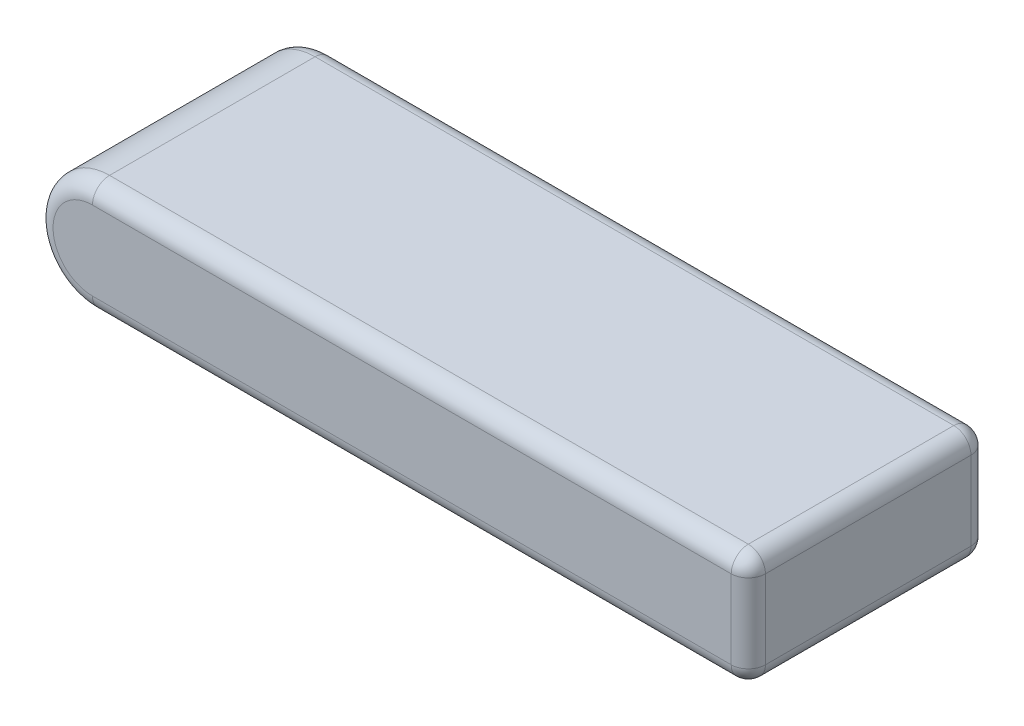
ISO-10303-21;
HEADER;
FILE_DESCRIPTION(('STEP AP214'),'2;1');
FILE_NAME('part.step','',(''),(''),'','','');
FILE_SCHEMA(('AUTOMOTIVE_DESIGN { 1 0 10303 214 1 1 1 1 }'));
ENDSEC;
DATA;
#1=APPLICATION_CONTEXT('core data for automotive mechanical design processes');
#2=APPLICATION_PROTOCOL_DEFINITION('international standard','automotive_design',2000,#1);
#3=PRODUCT_CONTEXT('',#1,'mechanical');
#4=PRODUCT('Part','Part','',(#3));
#5=PRODUCT_RELATED_PRODUCT_CATEGORY('part','',(#4));
#6=PRODUCT_DEFINITION_FORMATION('','',#4);
#7=PRODUCT_DEFINITION_CONTEXT('part definition',#1,'design');
#8=PRODUCT_DEFINITION('design','',#6,#7);
#9=PRODUCT_DEFINITION_SHAPE('','',#8);
#10=(LENGTH_UNIT() NAMED_UNIT(*) SI_UNIT(.MILLI.,.METRE.));
#11=(NAMED_UNIT(*) PLANE_ANGLE_UNIT() SI_UNIT($,.RADIAN.));
#12=(NAMED_UNIT(*) SI_UNIT($,.STERADIAN.) SOLID_ANGLE_UNIT());
#13=UNCERTAINTY_MEASURE_WITH_UNIT(LENGTH_MEASURE(1.E-05),#10,'distance_accuracy_value','');
#14=(GEOMETRIC_REPRESENTATION_CONTEXT(3) GLOBAL_UNCERTAINTY_ASSIGNED_CONTEXT((#13)) GLOBAL_UNIT_ASSIGNED_CONTEXT((#10,
#11,#12)) REPRESENTATION_CONTEXT('',''));
#15=CARTESIAN_POINT('',(0.,0.,0.));
#16=DIRECTION('',(0.,0.,1.));
#17=DIRECTION('',(1.,0.,0.));
#18=AXIS2_PLACEMENT_3D('',#15,#16,#17);
#19=CARTESIAN_POINT('',(-43.75,8.25,-17.5));
#20=DIRECTION('',(0.,0.,1.));
#21=DIRECTION('',(1.,0.,0.));
#22=AXIS2_PLACEMENT_3D('',#19,#20,#21);
#23=CYLINDRICAL_SURFACE('',#22,8.25);
#24=DIRECTION('',(0.,0.,1.));
#25=VECTOR('',#24,1.);
#26=CARTESIAN_POINT('',(-43.75,16.5,0.));
#27=LINE('',#26,#25);
#28=CARTESIAN_POINT('',(-43.75,16.5,-15.));
#29=VERTEX_POINT('',#28);
#30=CARTESIAN_POINT('',(-43.75,16.5,15.));
#31=VERTEX_POINT('',#30);
#32=EDGE_CURVE('E186',#29,#31,#27,.T.);
#33=ORIENTED_EDGE('',*,*,#32,.F.);
#34=CARTESIAN_POINT('',(-43.75,8.25,-15.));
#35=DIRECTION('',(0.,0.,1.));
#36=DIRECTION('',(1.,0.,0.));
#37=AXIS2_PLACEMENT_3D('',#34,#35,#36);
#38=CIRCLE('',#37,8.25);
#39=CARTESIAN_POINT('',(-43.75,0.,-15.));
#40=VERTEX_POINT('',#39);
#41=EDGE_CURVE('E200',#29,#40,#38,.T.);
#42=ORIENTED_EDGE('',*,*,#41,.T.);
#43=DIRECTION('',(0.,0.,-1.));
#44=VECTOR('',#43,1.);
#45=CARTESIAN_POINT('',(-43.75,0.,-17.5));
#46=LINE('',#45,#44);
#47=CARTESIAN_POINT('',(-43.75,0.,15.));
#48=VERTEX_POINT('',#47);
#49=EDGE_CURVE('E138',#48,#40,#46,.T.);
#50=ORIENTED_EDGE('',*,*,#49,.F.);
#51=CARTESIAN_POINT('',(-43.75,8.25,15.));
#52=DIRECTION('',(0.,0.,-1.));
#53=DIRECTION('',(-1.,0.,0.));
#54=AXIS2_PLACEMENT_3D('',#51,#52,#53);
#55=CIRCLE('',#54,8.25);
#56=EDGE_CURVE('E198',#48,#31,#55,.T.);
#57=ORIENTED_EDGE('',*,*,#56,.T.);
#58=EDGE_LOOP('',(#33,#42,#50,#57));
#59=FACE_BOUND('',#58,.T.);
#60=ADVANCED_FACE('F39',(#59),#23,.T.);
#61=CARTESIAN_POINT('',(-52.,16.5,17.5));
#62=DIRECTION('',(0.,0.,-1.));
#63=DIRECTION('',(-1.,0.,0.));
#64=AXIS2_PLACEMENT_3D('',#61,#62,#63);
#65=PLANE('',#64);
#66=DIRECTION('',(1.,0.,0.));
#67=VECTOR('',#66,1.);
#68=CARTESIAN_POINT('',(52.,2.5,17.5));
#69=LINE('',#68,#67);
#70=CARTESIAN_POINT('',(-43.75,2.5,17.5));
#71=VERTEX_POINT('',#70);
#72=CARTESIAN_POINT('',(49.5,2.5,17.5));
#73=VERTEX_POINT('',#72);
#74=EDGE_CURVE('E48',#71,#73,#69,.T.);
#75=ORIENTED_EDGE('',*,*,#74,.T.);
#76=DIRECTION('',(0.,-1.,0.));
#77=VECTOR('',#76,1.);
#78=CARTESIAN_POINT('',(49.5,16.5,17.5));
#79=LINE('',#78,#77);
#80=CARTESIAN_POINT('',(49.5,14.,17.5));
#81=VERTEX_POINT('',#80);
#82=EDGE_CURVE('E11',#73,#81,#79,.F.);
#83=ORIENTED_EDGE('',*,*,#82,.T.);
#84=DIRECTION('',(1.,0.,0.));
#85=VECTOR('',#84,1.);
#86=CARTESIAN_POINT('',(-52.,14.,17.5));
#87=LINE('',#86,#85);
#88=CARTESIAN_POINT('',(-43.75,14.,17.5));
#89=VERTEX_POINT('',#88);
#90=EDGE_CURVE('E223',#81,#89,#87,.F.);
#91=ORIENTED_EDGE('',*,*,#90,.T.);
#92=CARTESIAN_POINT('',(-43.75,8.25,17.5));
#93=DIRECTION('',(0.,0.,-1.));
#94=DIRECTION('',(-1.,0.,0.));
#95=AXIS2_PLACEMENT_3D('',#92,#93,#94);
#96=CIRCLE('',#95,5.75);
#97=EDGE_CURVE('E59',#89,#71,#96,.F.);
#98=ORIENTED_EDGE('',*,*,#97,.T.);
#99=EDGE_LOOP('',(#75,#83,#91,#98));
#100=FACE_BOUND('',#99,.T.);
#101=ADVANCED_FACE('F254',(#100),#65,.F.);
#102=CARTESIAN_POINT('',(52.,16.5,17.5));
#103=DIRECTION('',(-1.,0.,0.));
#104=DIRECTION('',(0.,0.,1.));
#105=AXIS2_PLACEMENT_3D('',#102,#103,#104);
#106=PLANE('',#105);
#107=DIRECTION('',(0.,-1.,0.));
#108=VECTOR('',#107,1.);
#109=CARTESIAN_POINT('',(52.,16.5,-15.));
#110=LINE('',#109,#108);
#111=CARTESIAN_POINT('',(52.,2.5,-15.));
#112=VERTEX_POINT('',#111);
#113=CARTESIAN_POINT('',(52.,14.,-15.));
#114=VERTEX_POINT('',#113);
#115=EDGE_CURVE('E218',#112,#114,#110,.F.);
#116=ORIENTED_EDGE('',*,*,#115,.T.);
#117=DIRECTION('',(0.,0.,-1.));
#118=VECTOR('',#117,1.);
#119=CARTESIAN_POINT('',(52.,14.,17.5));
#120=LINE('',#119,#118);
#121=CARTESIAN_POINT('',(52.,14.,15.));
#122=VERTEX_POINT('',#121);
#123=EDGE_CURVE('E220',#114,#122,#120,.F.);
#124=ORIENTED_EDGE('',*,*,#123,.T.);
#125=DIRECTION('',(0.,-1.,0.));
#126=VECTOR('',#125,1.);
#127=CARTESIAN_POINT('',(52.,16.5,15.));
#128=LINE('',#127,#126);
#129=CARTESIAN_POINT('',(52.,2.5,15.));
#130=VERTEX_POINT('',#129);
#131=EDGE_CURVE('E214',#122,#130,#128,.T.);
#132=ORIENTED_EDGE('',*,*,#131,.T.);
#133=DIRECTION('',(0.,0.,-1.));
#134=VECTOR('',#133,1.);
#135=CARTESIAN_POINT('',(52.,2.5,-17.5));
#136=LINE('',#135,#134);
#137=EDGE_CURVE('E216',#130,#112,#136,.T.);
#138=ORIENTED_EDGE('',*,*,#137,.T.);
#139=EDGE_LOOP('',(#116,#124,#132,#138));
#140=FACE_BOUND('',#139,.T.);
#141=ADVANCED_FACE('F248',(#140),#106,.F.);
#142=CARTESIAN_POINT('',(-52.,16.5,-17.5));
#143=DIRECTION('',(0.,0.,1.));
#144=DIRECTION('',(1.,0.,0.));
#145=AXIS2_PLACEMENT_3D('',#142,#143,#144);
#146=PLANE('',#145);
#147=DIRECTION('',(-1.,0.,0.));
#148=VECTOR('',#147,1.);
#149=CARTESIAN_POINT('',(-43.75,2.5,-17.5));
#150=LINE('',#149,#148);
#151=CARTESIAN_POINT('',(49.5,2.5,-17.5));
#152=VERTEX_POINT('',#151);
#153=CARTESIAN_POINT('',(-43.75,2.5,-17.5));
#154=VERTEX_POINT('',#153);
#155=EDGE_CURVE('E126',#152,#154,#150,.T.);
#156=ORIENTED_EDGE('',*,*,#155,.T.);
#157=CARTESIAN_POINT('',(-43.75,8.25,-17.5));
#158=DIRECTION('',(0.,0.,1.));
#159=DIRECTION('',(1.,0.,0.));
#160=AXIS2_PLACEMENT_3D('',#157,#158,#159);
#161=CIRCLE('',#160,5.75);
#162=CARTESIAN_POINT('',(-43.75,14.,-17.5));
#163=VERTEX_POINT('',#162);
#164=EDGE_CURVE('E122',#154,#163,#161,.F.);
#165=ORIENTED_EDGE('',*,*,#164,.T.);
#166=DIRECTION('',(-1.,0.,0.));
#167=VECTOR('',#166,1.);
#168=CARTESIAN_POINT('',(-52.,14.,-17.5));
#169=LINE('',#168,#167);
#170=CARTESIAN_POINT('',(49.5,14.,-17.5));
#171=VERTEX_POINT('',#170);
#172=EDGE_CURVE('E116',#163,#171,#169,.F.);
#173=ORIENTED_EDGE('',*,*,#172,.T.);
#174=DIRECTION('',(0.,-1.,0.));
#175=VECTOR('',#174,1.);
#176=CARTESIAN_POINT('',(49.5,16.5,-17.5));
#177=LINE('',#176,#175);
#178=EDGE_CURVE('E119',#171,#152,#177,.T.);
#179=ORIENTED_EDGE('',*,*,#178,.T.);
#180=EDGE_LOOP('',(#156,#165,#173,#179));
#181=FACE_BOUND('',#180,.T.);
#182=ADVANCED_FACE('F118',(#181),#146,.F.);
#183=CARTESIAN_POINT('',(0.,16.5,0.));
#184=DIRECTION('',(0.,-1.,0.));
#185=DIRECTION('',(0.,0.,-1.));
#186=AXIS2_PLACEMENT_3D('',#183,#184,#185);
#187=PLANE('',#186);
#188=DIRECTION('',(0.,0.,-1.));
#189=VECTOR('',#188,1.);
#190=CARTESIAN_POINT('',(49.5,16.5,0.));
#191=LINE('',#190,#189);
#192=CARTESIAN_POINT('',(49.5,16.5,15.));
#193=VERTEX_POINT('',#192);
#194=CARTESIAN_POINT('',(49.5,16.5,-15.));
#195=VERTEX_POINT('',#194);
#196=EDGE_CURVE('E211',#193,#195,#191,.T.);
#197=ORIENTED_EDGE('',*,*,#196,.T.);
#198=DIRECTION('',(-1.,0.,0.));
#199=VECTOR('',#198,1.);
#200=CARTESIAN_POINT('',(0.,16.5,-15.));
#201=LINE('',#200,#199);
#202=EDGE_CURVE('E149',#195,#29,#201,.T.);
#203=ORIENTED_EDGE('',*,*,#202,.T.);
#204=ORIENTED_EDGE('',*,*,#32,.T.);
#205=DIRECTION('',(1.,0.,0.));
#206=VECTOR('',#205,1.);
#207=CARTESIAN_POINT('',(0.,16.5,15.));
#208=LINE('',#207,#206);
#209=EDGE_CURVE('E209',#31,#193,#208,.T.);
#210=ORIENTED_EDGE('',*,*,#209,.T.);
#211=EDGE_LOOP('',(#197,#203,#204,#210));
#212=FACE_BOUND('',#211,.T.);
#213=ADVANCED_FACE('F259',(#212),#187,.F.);
#214=CARTESIAN_POINT('',(0.,0.,0.));
#215=DIRECTION('',(0.,-1.,0.));
#216=DIRECTION('',(0.,0.,-1.));
#217=AXIS2_PLACEMENT_3D('',#214,#215,#216);
#218=PLANE('',#217);
#219=ORIENTED_EDGE('',*,*,#49,.T.);
#220=DIRECTION('',(-1.,0.,0.));
#221=VECTOR('',#220,1.);
#222=CARTESIAN_POINT('',(52.,0.,-15.));
#223=LINE('',#222,#221);
#224=CARTESIAN_POINT('',(49.5,0.,-15.));
#225=VERTEX_POINT('',#224);
#226=EDGE_CURVE('E207',#40,#225,#223,.F.);
#227=ORIENTED_EDGE('',*,*,#226,.T.);
#228=DIRECTION('',(0.,0.,-1.));
#229=VECTOR('',#228,1.);
#230=CARTESIAN_POINT('',(49.5,0.,17.5));
#231=LINE('',#230,#229);
#232=CARTESIAN_POINT('',(49.5,0.,15.));
#233=VERTEX_POINT('',#232);
#234=EDGE_CURVE('E205',#225,#233,#231,.F.);
#235=ORIENTED_EDGE('',*,*,#234,.T.);
#236=DIRECTION('',(1.,0.,0.));
#237=VECTOR('',#236,1.);
#238=CARTESIAN_POINT('',(-43.75,0.,15.));
#239=LINE('',#238,#237);
#240=EDGE_CURVE('E203',#233,#48,#239,.F.);
#241=ORIENTED_EDGE('',*,*,#240,.T.);
#242=EDGE_LOOP('',(#219,#227,#235,#241));
#243=FACE_BOUND('',#242,.T.);
#244=ADVANCED_FACE('F235',(#243),#218,.T.);
#245=CARTESIAN_POINT('',(-43.75,8.25,15.));
#246=DIRECTION('',(0.,0.,-1.));
#247=DIRECTION('',(-1.,0.,0.));
#248=AXIS2_PLACEMENT_3D('',#245,#246,#247);
#249=TOROIDAL_SURFACE('',#248,5.75,2.5);
#250=CARTESIAN_POINT('',(-43.75,14.,15.));
#251=DIRECTION('',(1.,0.,0.));
#252=DIRECTION('',(0.,0.,-1.));
#253=AXIS2_PLACEMENT_3D('',#250,#251,#252);
#254=CIRCLE('',#253,2.5);
#255=EDGE_CURVE('E179',#31,#89,#254,.T.);
#256=ORIENTED_EDGE('',*,*,#255,.F.);
#257=ORIENTED_EDGE('',*,*,#56,.F.);
#258=CARTESIAN_POINT('',(-43.75,2.5,15.));
#259=DIRECTION('',(1.,0.,0.));
#260=DIRECTION('',(0.,0.,-1.));
#261=AXIS2_PLACEMENT_3D('',#258,#259,#260);
#262=CIRCLE('',#261,2.5);
#263=EDGE_CURVE('E43',#71,#48,#262,.T.);
#264=ORIENTED_EDGE('',*,*,#263,.F.);
#265=ORIENTED_EDGE('',*,*,#97,.F.);
#266=EDGE_LOOP('',(#256,#257,#264,#265));
#267=FACE_BOUND('',#266,.T.);
#268=ADVANCED_FACE('F41',(#267),#249,.T.);
#269=CARTESIAN_POINT('',(-52.,2.5,15.));
#270=DIRECTION('',(-1.,0.,0.));
#271=DIRECTION('',(0.,0.,1.));
#272=AXIS2_PLACEMENT_3D('',#269,#270,#271);
#273=CYLINDRICAL_SURFACE('',#272,2.5);
#274=ORIENTED_EDGE('',*,*,#263,.T.);
#275=ORIENTED_EDGE('',*,*,#240,.F.);
#276=CARTESIAN_POINT('',(49.5,2.5,15.));
#277=DIRECTION('',(1.,0.,0.));
#278=DIRECTION('',(0.,0.,-1.));
#279=AXIS2_PLACEMENT_3D('',#276,#277,#278);
#280=CIRCLE('',#279,2.5);
#281=EDGE_CURVE('E177',#73,#233,#280,.T.);
#282=ORIENTED_EDGE('',*,*,#281,.F.);
#283=ORIENTED_EDGE('',*,*,#74,.F.);
#284=EDGE_LOOP('',(#274,#275,#282,#283));
#285=FACE_BOUND('',#284,.T.);
#286=ADVANCED_FACE('F238',(#285),#273,.T.);
#287=CARTESIAN_POINT('',(49.5,16.5,15.));
#288=DIRECTION('',(0.,-1.,0.));
#289=DIRECTION('',(0.,0.,-1.));
#290=AXIS2_PLACEMENT_3D('',#287,#288,#289);
#291=CYLINDRICAL_SURFACE('',#290,2.5);
#292=CARTESIAN_POINT('',(49.5,14.,15.));
#293=DIRECTION('',(0.,1.,0.));
#294=DIRECTION('',(0.,0.,1.));
#295=AXIS2_PLACEMENT_3D('',#292,#293,#294);
#296=CIRCLE('',#295,2.5);
#297=EDGE_CURVE('E171',#81,#122,#296,.T.);
#298=ORIENTED_EDGE('',*,*,#297,.F.);
#299=ORIENTED_EDGE('',*,*,#82,.F.);
#300=CARTESIAN_POINT('',(49.5,2.5,15.));
#301=DIRECTION('',(0.,-1.,0.));
#302=DIRECTION('',(0.,0.,-1.));
#303=AXIS2_PLACEMENT_3D('',#300,#301,#302);
#304=CIRCLE('',#303,2.5);
#305=EDGE_CURVE('E174',#130,#73,#304,.T.);
#306=ORIENTED_EDGE('',*,*,#305,.F.);
#307=ORIENTED_EDGE('',*,*,#131,.F.);
#308=EDGE_LOOP('',(#298,#299,#306,#307));
#309=FACE_BOUND('',#308,.T.);
#310=ADVANCED_FACE('F253',(#309),#291,.T.);
#311=CARTESIAN_POINT('',(0.,14.,15.));
#312=DIRECTION('',(1.,0.,0.));
#313=DIRECTION('',(0.,0.,-1.));
#314=AXIS2_PLACEMENT_3D('',#311,#312,#313);
#315=CYLINDRICAL_SURFACE('',#314,2.5);
#316=ORIENTED_EDGE('',*,*,#255,.T.);
#317=ORIENTED_EDGE('',*,*,#90,.F.);
#318=CARTESIAN_POINT('',(49.5,14.,15.));
#319=DIRECTION('',(1.,0.,0.));
#320=DIRECTION('',(0.,0.,-1.));
#321=AXIS2_PLACEMENT_3D('',#318,#319,#320);
#322=CIRCLE('',#321,2.5);
#323=EDGE_CURVE('E169',#193,#81,#322,.T.);
#324=ORIENTED_EDGE('',*,*,#323,.F.);
#325=ORIENTED_EDGE('',*,*,#209,.F.);
#326=EDGE_LOOP('',(#316,#317,#324,#325));
#327=FACE_BOUND('',#326,.T.);
#328=ADVANCED_FACE('F257',(#327),#315,.T.);
#329=CARTESIAN_POINT('',(49.5,2.5,15.));
#330=DIRECTION('',(0.,0.,1.));
#331=DIRECTION('',(0.,-1.,0.));
#332=AXIS2_PLACEMENT_3D('',#329,#330,#331);
#333=SPHERICAL_SURFACE('',#332,2.5);
#334=ORIENTED_EDGE('',*,*,#305,.T.);
#335=ORIENTED_EDGE('',*,*,#281,.T.);
#336=CARTESIAN_POINT('',(49.5,2.5,15.));
#337=DIRECTION('',(0.,0.,1.));
#338=DIRECTION('',(1.,0.,0.));
#339=AXIS2_PLACEMENT_3D('',#336,#337,#338);
#340=CIRCLE('',#339,2.5);
#341=EDGE_CURVE('E166',#130,#233,#340,.F.);
#342=ORIENTED_EDGE('',*,*,#341,.F.);
#343=EDGE_LOOP('',(#334,#335,#342));
#344=FACE_BOUND('',#343,.T.);
#345=ADVANCED_FACE('F241',(#344),#333,.T.);
#346=CARTESIAN_POINT('',(49.5,14.,15.));
#347=DIRECTION('',(0.,0.,1.));
#348=DIRECTION('',(1.,0.,0.));
#349=AXIS2_PLACEMENT_3D('',#346,#347,#348);
#350=SPHERICAL_SURFACE('',#349,2.5);
#351=ORIENTED_EDGE('',*,*,#323,.T.);
#352=ORIENTED_EDGE('',*,*,#297,.T.);
#353=CARTESIAN_POINT('',(49.5,14.,15.));
#354=DIRECTION('',(0.,0.,1.));
#355=DIRECTION('',(1.,0.,0.));
#356=AXIS2_PLACEMENT_3D('',#353,#354,#355);
#357=CIRCLE('',#356,2.5);
#358=EDGE_CURVE('E164',#193,#122,#357,.F.);
#359=ORIENTED_EDGE('',*,*,#358,.F.);
#360=EDGE_LOOP('',(#351,#352,#359));
#361=FACE_BOUND('',#360,.T.);
#362=ADVANCED_FACE('F264',(#361),#350,.T.);
#363=CARTESIAN_POINT('',(49.5,2.5,17.5));
#364=DIRECTION('',(0.,0.,1.));
#365=DIRECTION('',(1.,0.,0.));
#366=AXIS2_PLACEMENT_3D('',#363,#364,#365);
#367=CYLINDRICAL_SURFACE('',#366,2.5);
#368=ORIENTED_EDGE('',*,*,#341,.T.);
#369=ORIENTED_EDGE('',*,*,#234,.F.);
#370=CARTESIAN_POINT('',(49.5,2.5,-15.));
#371=DIRECTION('',(0.,0.,-1.));
#372=DIRECTION('',(-1.,0.,0.));
#373=AXIS2_PLACEMENT_3D('',#370,#371,#372);
#374=CIRCLE('',#373,2.5);
#375=EDGE_CURVE('E161',#112,#225,#374,.T.);
#376=ORIENTED_EDGE('',*,*,#375,.F.);
#377=ORIENTED_EDGE('',*,*,#137,.F.);
#378=EDGE_LOOP('',(#368,#369,#376,#377));
#379=FACE_BOUND('',#378,.T.);
#380=ADVANCED_FACE('F245',(#379),#367,.T.);
#381=CARTESIAN_POINT('',(49.5,16.5,-15.));
#382=DIRECTION('',(0.,-1.,0.));
#383=DIRECTION('',(0.,0.,-1.));
#384=AXIS2_PLACEMENT_3D('',#381,#382,#383);
#385=CYLINDRICAL_SURFACE('',#384,2.5);
#386=CARTESIAN_POINT('',(49.5,14.,-15.));
#387=DIRECTION('',(0.,1.,0.));
#388=DIRECTION('',(0.,0.,1.));
#389=AXIS2_PLACEMENT_3D('',#386,#387,#388);
#390=CIRCLE('',#389,2.5);
#391=EDGE_CURVE('E133',#114,#171,#390,.T.);
#392=ORIENTED_EDGE('',*,*,#391,.F.);
#393=ORIENTED_EDGE('',*,*,#115,.F.);
#394=CARTESIAN_POINT('',(49.5,2.5,-15.));
#395=DIRECTION('',(0.,-1.,0.));
#396=DIRECTION('',(0.,0.,-1.));
#397=AXIS2_PLACEMENT_3D('',#394,#395,#396);
#398=CIRCLE('',#397,2.5);
#399=EDGE_CURVE('E136',#152,#112,#398,.T.);
#400=ORIENTED_EDGE('',*,*,#399,.F.);
#401=ORIENTED_EDGE('',*,*,#178,.F.);
#402=EDGE_LOOP('',(#392,#393,#400,#401));
#403=FACE_BOUND('',#402,.T.);
#404=ADVANCED_FACE('F131',(#403),#385,.T.);
#405=CARTESIAN_POINT('',(49.5,14.,0.));
#406=DIRECTION('',(0.,0.,-1.));
#407=DIRECTION('',(-1.,0.,0.));
#408=AXIS2_PLACEMENT_3D('',#405,#406,#407);
#409=CYLINDRICAL_SURFACE('',#408,2.5);
#410=ORIENTED_EDGE('',*,*,#358,.T.);
#411=ORIENTED_EDGE('',*,*,#123,.F.);
#412=CARTESIAN_POINT('',(49.5,14.,-15.));
#413=DIRECTION('',(0.,0.,-1.));
#414=DIRECTION('',(-1.,0.,0.));
#415=AXIS2_PLACEMENT_3D('',#412,#413,#414);
#416=CIRCLE('',#415,2.5);
#417=EDGE_CURVE('E146',#195,#114,#416,.T.);
#418=ORIENTED_EDGE('',*,*,#417,.F.);
#419=ORIENTED_EDGE('',*,*,#196,.F.);
#420=EDGE_LOOP('',(#410,#411,#418,#419));
#421=FACE_BOUND('',#420,.T.);
#422=ADVANCED_FACE('F262',(#421),#409,.T.);
#423=CARTESIAN_POINT('',(49.5,2.5,-15.));
#424=DIRECTION('',(1.,0.,0.));
#425=DIRECTION('',(0.,1.,0.));
#426=AXIS2_PLACEMENT_3D('',#423,#424,#425);
#427=SPHERICAL_SURFACE('',#426,2.5);
#428=ORIENTED_EDGE('',*,*,#399,.T.);
#429=ORIENTED_EDGE('',*,*,#375,.T.);
#430=CARTESIAN_POINT('',(49.5,2.5,-15.));
#431=DIRECTION('',(1.,0.,0.));
#432=DIRECTION('',(0.,0.,-1.));
#433=AXIS2_PLACEMENT_3D('',#430,#431,#432);
#434=CIRCLE('',#433,2.5);
#435=EDGE_CURVE('E150',#152,#225,#434,.F.);
#436=ORIENTED_EDGE('',*,*,#435,.F.);
#437=EDGE_LOOP('',(#428,#429,#436));
#438=FACE_BOUND('',#437,.T.);
#439=ADVANCED_FACE('F294',(#438),#427,.T.);
#440=CARTESIAN_POINT('',(49.5,14.,-15.));
#441=DIRECTION('',(1.,0.,0.));
#442=DIRECTION('',(0.,0.,-1.));
#443=AXIS2_PLACEMENT_3D('',#440,#441,#442);
#444=SPHERICAL_SURFACE('',#443,2.5);
#445=ORIENTED_EDGE('',*,*,#417,.T.);
#446=ORIENTED_EDGE('',*,*,#391,.T.);
#447=CARTESIAN_POINT('',(49.5,14.,-15.));
#448=DIRECTION('',(1.,0.,0.));
#449=DIRECTION('',(0.,0.,-1.));
#450=AXIS2_PLACEMENT_3D('',#447,#448,#449);
#451=CIRCLE('',#450,2.5);
#452=EDGE_CURVE('E143',#195,#171,#451,.F.);
#453=ORIENTED_EDGE('',*,*,#452,.F.);
#454=EDGE_LOOP('',(#445,#446,#453));
#455=FACE_BOUND('',#454,.T.);
#456=ADVANCED_FACE('F142',(#455),#444,.T.);
#457=CARTESIAN_POINT('',(-52.,2.5,-15.));
#458=DIRECTION('',(1.,0.,0.));
#459=DIRECTION('',(0.,0.,-1.));
#460=AXIS2_PLACEMENT_3D('',#457,#458,#459);
#461=CYLINDRICAL_SURFACE('',#460,2.5);
#462=ORIENTED_EDGE('',*,*,#435,.T.);
#463=ORIENTED_EDGE('',*,*,#226,.F.);
#464=CARTESIAN_POINT('',(-43.75,2.5,-15.));
#465=DIRECTION('',(-1.,0.,0.));
#466=DIRECTION('',(0.,0.,1.));
#467=AXIS2_PLACEMENT_3D('',#464,#465,#466);
#468=CIRCLE('',#467,2.5);
#469=EDGE_CURVE('E151',#154,#40,#468,.T.);
#470=ORIENTED_EDGE('',*,*,#469,.F.);
#471=ORIENTED_EDGE('',*,*,#155,.F.);
#472=EDGE_LOOP('',(#462,#463,#470,#471));
#473=FACE_BOUND('',#472,.T.);
#474=ADVANCED_FACE('F288',(#473),#461,.T.);
#475=CARTESIAN_POINT('',(0.,14.,-15.));
#476=DIRECTION('',(-1.,0.,0.));
#477=DIRECTION('',(0.,0.,1.));
#478=AXIS2_PLACEMENT_3D('',#475,#476,#477);
#479=CYLINDRICAL_SURFACE('',#478,2.5);
#480=ORIENTED_EDGE('',*,*,#452,.T.);
#481=ORIENTED_EDGE('',*,*,#172,.F.);
#482=CARTESIAN_POINT('',(-43.75,14.,-15.));
#483=DIRECTION('',(-1.,0.,0.));
#484=DIRECTION('',(0.,0.,1.));
#485=AXIS2_PLACEMENT_3D('',#482,#483,#484);
#486=CIRCLE('',#485,2.5);
#487=EDGE_CURVE('E155',#29,#163,#486,.T.);
#488=ORIENTED_EDGE('',*,*,#487,.F.);
#489=ORIENTED_EDGE('',*,*,#202,.F.);
#490=EDGE_LOOP('',(#480,#481,#488,#489));
#491=FACE_BOUND('',#490,.T.);
#492=ADVANCED_FACE('F148',(#491),#479,.T.);
#493=CARTESIAN_POINT('',(-43.75,8.25,-15.));
#494=DIRECTION('',(0.,0.,1.));
#495=DIRECTION('',(1.,0.,0.));
#496=AXIS2_PLACEMENT_3D('',#493,#494,#495);
#497=TOROIDAL_SURFACE('',#496,5.75,2.5);
#498=ORIENTED_EDGE('',*,*,#469,.T.);
#499=ORIENTED_EDGE('',*,*,#41,.F.);
#500=ORIENTED_EDGE('',*,*,#487,.T.);
#501=ORIENTED_EDGE('',*,*,#164,.F.);
#502=EDGE_LOOP('',(#498,#499,#500,#501));
#503=FACE_BOUND('',#502,.T.);
#504=ADVANCED_FACE('F228',(#503),#497,.T.);
#505=CLOSED_SHELL('',(#60,#101,#141,#182,#213,#244,#268,#286,#310,#328,#345,#362,#380,#404,#422,
#439,#456,#474,#492,#504));
#506=MANIFOLD_SOLID_BREP('B2',#505);
#507=ADVANCED_BREP_SHAPE_REPRESENTATION('',(#18,#506),#14);
#508=SHAPE_DEFINITION_REPRESENTATION(#9,#507);
ENDSEC;
END-ISO-10303-21;
